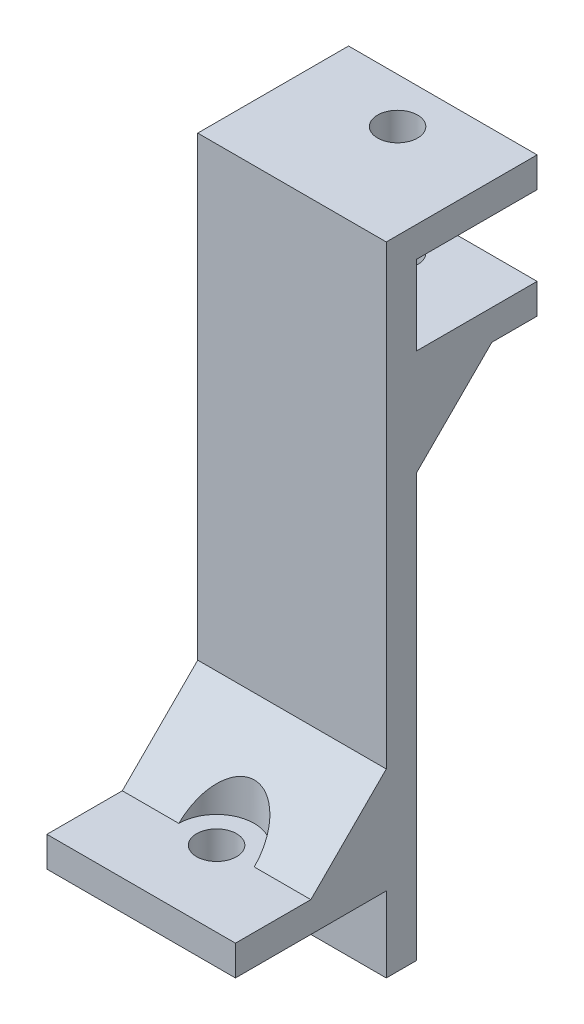
ISO-10303-21;
HEADER;
FILE_DESCRIPTION(('STEP AP214'),'2;1');
FILE_NAME('part.step','',(''),(''),'','','');
FILE_SCHEMA(('AUTOMOTIVE_DESIGN { 1 0 10303 214 1 1 1 1 }'));
ENDSEC;
DATA;
#1=APPLICATION_CONTEXT('core data for automotive mechanical design processes');
#2=APPLICATION_PROTOCOL_DEFINITION('international standard','automotive_design',2000,#1);
#3=PRODUCT_CONTEXT('',#1,'mechanical');
#4=PRODUCT('Part','Part','',(#3));
#5=PRODUCT_RELATED_PRODUCT_CATEGORY('part','',(#4));
#6=PRODUCT_DEFINITION_FORMATION('','',#4);
#7=PRODUCT_DEFINITION_CONTEXT('part definition',#1,'design');
#8=PRODUCT_DEFINITION('design','',#6,#7);
#9=PRODUCT_DEFINITION_SHAPE('','',#8);
#10=(LENGTH_UNIT() NAMED_UNIT(*) SI_UNIT(.MILLI.,.METRE.));
#11=(NAMED_UNIT(*) PLANE_ANGLE_UNIT() SI_UNIT($,.RADIAN.));
#12=(NAMED_UNIT(*) SI_UNIT($,.STERADIAN.) SOLID_ANGLE_UNIT());
#13=UNCERTAINTY_MEASURE_WITH_UNIT(LENGTH_MEASURE(1.E-05),#10,'distance_accuracy_value','');
#14=(GEOMETRIC_REPRESENTATION_CONTEXT(3) GLOBAL_UNCERTAINTY_ASSIGNED_CONTEXT((#13)) GLOBAL_UNIT_ASSIGNED_CONTEXT((#10,
#11,#12)) REPRESENTATION_CONTEXT('',''));
#15=CARTESIAN_POINT('',(0.,0.,0.));
#16=DIRECTION('',(0.,0.,1.));
#17=DIRECTION('',(1.,0.,0.));
#18=AXIS2_PLACEMENT_3D('',#15,#16,#17);
#19=CARTESIAN_POINT('',(12.5,0.,-14.));
#20=DIRECTION('',(0.,1.,0.));
#21=DIRECTION('',(0.,0.,1.));
#22=AXIS2_PLACEMENT_3D('',#19,#20,#21);
#23=CYLINDRICAL_SURFACE('',#22,2.65);
#24=CARTESIAN_POINT('',(12.5,70.,-13.9999999999999));
#25=DIRECTION('',(0.,-1.,0.));
#26=DIRECTION('',(0.,0.,-1.));
#27=AXIS2_PLACEMENT_3D('',#24,#25,#26);
#28=CIRCLE('',#27,2.65);
#29=CARTESIAN_POINT('',(12.5,70.,-16.6499999999999));
#30=VERTEX_POINT('',#29);
#31=EDGE_CURVE('E469',#30,#30,#28,.T.);
#32=ORIENTED_EDGE('',*,*,#31,.F.);
#33=EDGE_LOOP('',(#32));
#34=FACE_BOUND('',#33,.T.);
#35=CARTESIAN_POINT('',(12.5,66.,-13.9999999999999));
#36=DIRECTION('',(0.,1.,0.));
#37=DIRECTION('',(0.,0.,1.));
#38=AXIS2_PLACEMENT_3D('',#35,#36,#37);
#39=CIRCLE('',#38,2.65);
#40=CARTESIAN_POINT('',(12.5,66.,-11.3499999999999));
#41=VERTEX_POINT('',#40);
#42=EDGE_CURVE('E344',#41,#41,#39,.T.);
#43=ORIENTED_EDGE('',*,*,#42,.F.);
#44=EDGE_LOOP('',(#43));
#45=FACE_BOUND('',#44,.T.);
#46=ADVANCED_FACE('F41',(#34,#45),#23,.F.);
#47=CARTESIAN_POINT('',(25.,66.,-14.0000000000002));
#48=DIRECTION('',(0.,-0.707106781186551,-0.707106781186544));
#49=DIRECTION('',(1.,0.,0.));
#50=AXIS2_PLACEMENT_3D('',#47,#48,#49);
#51=PLANE('',#50);
#52=CARTESIAN_POINT('',(12.5,65.9999999999997,-13.9999999999999));
#53=DIRECTION('',(0.,-0.707106781186551,-0.707106781186544));
#54=DIRECTION('',(0.,0.707106781186544,-0.707106781186551));
#55=AXIS2_PLACEMENT_3D('',#52,#53,#54);
#56=ELLIPSE('',#55,7.07106781186543,5.);
#57=CARTESIAN_POINT('',(17.5,66.,-14.0000000000002));
#58=VERTEX_POINT('',#57);
#59=CARTESIAN_POINT('',(7.5,66.,-14.0000000000002));
#60=VERTEX_POINT('',#59);
#61=EDGE_CURVE('E11',#58,#60,#56,.T.);
#62=ORIENTED_EDGE('',*,*,#61,.F.);
#63=DIRECTION('',(-1.,0.,0.));
#64=VECTOR('',#63,1.);
#65=CARTESIAN_POINT('',(0.,66.,-14.0000000000002));
#66=LINE('',#65,#64);
#67=CARTESIAN_POINT('',(25.,66.,-14.0000000000002));
#68=VERTEX_POINT('',#67);
#69=EDGE_CURVE('E179',#68,#58,#66,.T.);
#70=ORIENTED_EDGE('',*,*,#69,.F.);
#71=DIRECTION('',(0.,-0.707106781186544,0.707106781186551));
#72=VECTOR('',#71,1.);
#73=CARTESIAN_POINT('',(25.,26.0000000000002,26.));
#74=LINE('',#73,#72);
#75=CARTESIAN_POINT('',(25.,55.9999999999999,-3.99999999999999));
#76=VERTEX_POINT('',#75);
#77=EDGE_CURVE('E51',#76,#68,#74,.F.);
#78=ORIENTED_EDGE('',*,*,#77,.F.);
#79=DIRECTION('',(1.,0.,0.));
#80=VECTOR('',#79,1.);
#81=CARTESIAN_POINT('',(25.,55.9999999999999,-3.99999999999999));
#82=LINE('',#81,#80);
#83=CARTESIAN_POINT('',(0.,55.9999999999999,-3.99999999999999));
#84=VERTEX_POINT('',#83);
#85=EDGE_CURVE('E58',#84,#76,#82,.T.);
#86=ORIENTED_EDGE('',*,*,#85,.F.);
#87=DIRECTION('',(0.,0.707106781186544,-0.707106781186551));
#88=VECTOR('',#87,1.);
#89=CARTESIAN_POINT('',(0.,66.,-14.0000000000002));
#90=LINE('',#89,#88);
#91=CARTESIAN_POINT('',(0.,66.,-14.0000000000002));
#92=VERTEX_POINT('',#91);
#93=EDGE_CURVE('E66',#92,#84,#90,.F.);
#94=ORIENTED_EDGE('',*,*,#93,.F.);
#95=DIRECTION('',(-1.,0.,0.));
#96=VECTOR('',#95,1.);
#97=CARTESIAN_POINT('',(0.,66.,-14.0000000000002));
#98=LINE('',#97,#96);
#99=EDGE_CURVE('E180',#60,#92,#98,.T.);
#100=ORIENTED_EDGE('',*,*,#99,.F.);
#101=EDGE_LOOP('',(#62,#70,#78,#86,#94,#100));
#102=FACE_BOUND('',#101,.T.);
#103=ADVANCED_FACE('F44',(#102),#51,.T.);
#104=CARTESIAN_POINT('',(12.5,20.,10.));
#105=DIRECTION('',(0.,-1.,0.));
#106=DIRECTION('',(0.,0.,-1.));
#107=AXIS2_PLACEMENT_3D('',#104,#105,#106);
#108=CYLINDRICAL_SURFACE('',#107,2.65);
#109=CARTESIAN_POINT('',(12.5,10.,10.));
#110=DIRECTION('',(0.,1.,0.));
#111=DIRECTION('',(0.,0.,1.));
#112=AXIS2_PLACEMENT_3D('',#109,#110,#111);
#113=CIRCLE('',#112,2.65);
#114=CARTESIAN_POINT('',(12.5,10.,12.65));
#115=VERTEX_POINT('',#114);
#116=EDGE_CURVE('E340',#115,#115,#113,.F.);
#117=ORIENTED_EDGE('',*,*,#116,.T.);
#118=EDGE_LOOP('',(#117));
#119=FACE_BOUND('',#118,.T.);
#120=CARTESIAN_POINT('',(12.5,14.,10.));
#121=DIRECTION('',(0.,-1.,0.));
#122=DIRECTION('',(0.,0.,-1.));
#123=AXIS2_PLACEMENT_3D('',#120,#121,#122);
#124=CIRCLE('',#123,2.65);
#125=CARTESIAN_POINT('',(12.5,14.,7.35));
#126=VERTEX_POINT('',#125);
#127=EDGE_CURVE('E254',#126,#126,#124,.F.);
#128=ORIENTED_EDGE('',*,*,#127,.T.);
#129=EDGE_LOOP('',(#128));
#130=FACE_BOUND('',#129,.T.);
#131=ADVANCED_FACE('F449',(#119,#130),#108,.F.);
#132=CARTESIAN_POINT('',(25.,14.,10.0000000000002));
#133=DIRECTION('',(0.,0.707106781186551,0.707106781186544));
#134=DIRECTION('',(1.,0.,0.));
#135=AXIS2_PLACEMENT_3D('',#132,#133,#134);
#136=PLANE('',#135);
#137=CARTESIAN_POINT('',(12.5,14.0000000000002,10.));
#138=DIRECTION('',(0.,0.707106781186551,0.707106781186544));
#139=DIRECTION('',(0.,-0.707106781186544,0.707106781186551));
#140=AXIS2_PLACEMENT_3D('',#137,#138,#139);
#141=ELLIPSE('',#140,7.07106781186544,5.);
#142=CARTESIAN_POINT('',(17.5,14.,10.0000000000002));
#143=VERTEX_POINT('',#142);
#144=CARTESIAN_POINT('',(7.5,14.,10.0000000000002));
#145=VERTEX_POINT('',#144);
#146=EDGE_CURVE('E191',#143,#145,#141,.T.);
#147=ORIENTED_EDGE('',*,*,#146,.F.);
#148=DIRECTION('',(-1.,0.,0.));
#149=VECTOR('',#148,1.);
#150=CARTESIAN_POINT('',(0.,14.,10.0000000000002));
#151=LINE('',#150,#149);
#152=CARTESIAN_POINT('',(25.,14.,10.0000000000002));
#153=VERTEX_POINT('',#152);
#154=EDGE_CURVE('E347',#153,#143,#151,.T.);
#155=ORIENTED_EDGE('',*,*,#154,.F.);
#156=DIRECTION('',(0.,0.707106781186544,-0.707106781186551));
#157=VECTOR('',#156,1.);
#158=CARTESIAN_POINT('',(25.,12.0000000000002,12.));
#159=LINE('',#158,#157);
#160=CARTESIAN_POINT('',(25.,24.0000000000001,0.));
#161=VERTEX_POINT('',#160);
#162=EDGE_CURVE('E357',#161,#153,#159,.F.);
#163=ORIENTED_EDGE('',*,*,#162,.F.);
#164=DIRECTION('',(1.,0.,0.));
#165=VECTOR('',#164,1.);
#166=CARTESIAN_POINT('',(25.,24.0000000000001,0.));
#167=LINE('',#166,#165);
#168=CARTESIAN_POINT('',(0.,24.0000000000001,0.));
#169=VERTEX_POINT('',#168);
#170=EDGE_CURVE('E351',#169,#161,#167,.T.);
#171=ORIENTED_EDGE('',*,*,#170,.F.);
#172=DIRECTION('',(0.,-0.707106781186544,0.707106781186551));
#173=VECTOR('',#172,1.);
#174=CARTESIAN_POINT('',(0.,14.,10.0000000000002));
#175=LINE('',#174,#173);
#176=CARTESIAN_POINT('',(0.,14.,10.0000000000002));
#177=VERTEX_POINT('',#176);
#178=EDGE_CURVE('E354',#177,#169,#175,.F.);
#179=ORIENTED_EDGE('',*,*,#178,.F.);
#180=DIRECTION('',(-1.,0.,0.));
#181=VECTOR('',#180,1.);
#182=CARTESIAN_POINT('',(0.,14.,10.0000000000002));
#183=LINE('',#182,#181);
#184=EDGE_CURVE('E339',#145,#177,#183,.T.);
#185=ORIENTED_EDGE('',*,*,#184,.F.);
#186=EDGE_LOOP('',(#147,#155,#163,#171,#179,#185));
#187=FACE_BOUND('',#186,.T.);
#188=ADVANCED_FACE('F376',(#187),#136,.T.);
#189=CARTESIAN_POINT('',(25.,0.,-4.));
#190=DIRECTION('',(0.,1.,0.));
#191=DIRECTION('',(0.,0.,1.));
#192=AXIS2_PLACEMENT_3D('',#189,#190,#191);
#193=PLANE('',#192);
#194=DIRECTION('',(0.,0.,-1.));
#195=VECTOR('',#194,1.);
#196=CARTESIAN_POINT('',(0.,0.,-4.));
#197=LINE('',#196,#195);
#198=CARTESIAN_POINT('',(0.,0.,0.));
#199=VERTEX_POINT('',#198);
#200=CARTESIAN_POINT('',(0.,0.,-4.));
#201=VERTEX_POINT('',#200);
#202=EDGE_CURVE('E249',#199,#201,#197,.T.);
#203=ORIENTED_EDGE('',*,*,#202,.T.);
#204=DIRECTION('',(-1.,0.,0.));
#205=VECTOR('',#204,1.);
#206=CARTESIAN_POINT('',(25.,0.,-4.));
#207=LINE('',#206,#205);
#208=CARTESIAN_POINT('',(25.,0.,-4.));
#209=VERTEX_POINT('',#208);
#210=EDGE_CURVE('E336',#209,#201,#207,.T.);
#211=ORIENTED_EDGE('',*,*,#210,.F.);
#212=DIRECTION('',(0.,0.,-1.));
#213=VECTOR('',#212,1.);
#214=CARTESIAN_POINT('',(25.,0.,-4.));
#215=LINE('',#214,#213);
#216=CARTESIAN_POINT('',(25.,0.,0.));
#217=VERTEX_POINT('',#216);
#218=EDGE_CURVE('E202',#217,#209,#215,.T.);
#219=ORIENTED_EDGE('',*,*,#218,.F.);
#220=DIRECTION('',(-1.,0.,0.));
#221=VECTOR('',#220,1.);
#222=CARTESIAN_POINT('',(25.,0.,0.));
#223=LINE('',#222,#221);
#224=EDGE_CURVE('E248',#217,#199,#223,.T.);
#225=ORIENTED_EDGE('',*,*,#224,.T.);
#226=EDGE_LOOP('',(#203,#211,#219,#225));
#227=FACE_BOUND('',#226,.T.);
#228=ADVANCED_FACE('F432',(#227),#193,.F.);
#229=CARTESIAN_POINT('',(25.,66.,-3.99999999999999));
#230=DIRECTION('',(0.,0.,1.));
#231=DIRECTION('',(0.,-1.,0.));
#232=AXIS2_PLACEMENT_3D('',#229,#230,#231);
#233=PLANE('',#232);
#234=DIRECTION('',(0.,1.,0.));
#235=VECTOR('',#234,1.);
#236=CARTESIAN_POINT('',(0.,66.,-3.99999999999999));
#237=LINE('',#236,#235);
#238=EDGE_CURVE('E253',#201,#84,#237,.T.);
#239=ORIENTED_EDGE('',*,*,#238,.T.);
#240=ORIENTED_EDGE('',*,*,#85,.T.);
#241=DIRECTION('',(0.,1.,0.));
#242=VECTOR('',#241,1.);
#243=CARTESIAN_POINT('',(25.,66.,-3.99999999999999));
#244=LINE('',#243,#242);
#245=EDGE_CURVE('E200',#209,#76,#244,.T.);
#246=ORIENTED_EDGE('',*,*,#245,.F.);
#247=ORIENTED_EDGE('',*,*,#210,.T.);
#248=EDGE_LOOP('',(#239,#240,#246,#247));
#249=FACE_BOUND('',#248,.T.);
#250=ADVANCED_FACE('F433',(#249),#233,.F.);
#251=CARTESIAN_POINT('',(25.,66.,-20.));
#252=DIRECTION('',(0.,1.,0.));
#253=DIRECTION('',(0.,0.,1.));
#254=AXIS2_PLACEMENT_3D('',#251,#252,#253);
#255=PLANE('',#254);
#256=ORIENTED_EDGE('',*,*,#69,.T.);
#257=CARTESIAN_POINT('',(12.5,66.,-13.9999999999999));
#258=DIRECTION('',(0.,-1.,0.));
#259=DIRECTION('',(0.,0.,-1.));
#260=AXIS2_PLACEMENT_3D('',#257,#258,#259);
#261=CIRCLE('',#260,5.);
#262=EDGE_CURVE('E167',#58,#60,#261,.T.);
#263=ORIENTED_EDGE('',*,*,#262,.T.);
#264=ORIENTED_EDGE('',*,*,#99,.T.);
#265=DIRECTION('',(0.,0.,-1.));
#266=VECTOR('',#265,1.);
#267=CARTESIAN_POINT('',(0.,66.,-20.));
#268=LINE('',#267,#266);
#269=CARTESIAN_POINT('',(0.,66.,-20.));
#270=VERTEX_POINT('',#269);
#271=EDGE_CURVE('E257',#92,#270,#268,.T.);
#272=ORIENTED_EDGE('',*,*,#271,.T.);
#273=DIRECTION('',(-1.,0.,0.));
#274=VECTOR('',#273,1.);
#275=CARTESIAN_POINT('',(25.,66.,-20.));
#276=LINE('',#275,#274);
#277=CARTESIAN_POINT('',(25.,66.,-20.));
#278=VERTEX_POINT('',#277);
#279=EDGE_CURVE('E332',#278,#270,#276,.T.);
#280=ORIENTED_EDGE('',*,*,#279,.F.);
#281=DIRECTION('',(0.,0.,-1.));
#282=VECTOR('',#281,1.);
#283=CARTESIAN_POINT('',(25.,66.,-20.));
#284=LINE('',#283,#282);
#285=EDGE_CURVE('E185',#68,#278,#284,.T.);
#286=ORIENTED_EDGE('',*,*,#285,.F.);
#287=EDGE_LOOP('',(#256,#263,#264,#272,#280,#286));
#288=FACE_BOUND('',#287,.T.);
#289=ORIENTED_EDGE('',*,*,#42,.T.);
#290=EDGE_LOOP('',(#289));
#291=FACE_BOUND('',#290,.T.);
#292=ADVANCED_FACE('F182',(#288,#291),#255,.F.);
#293=CARTESIAN_POINT('',(25.,70.,-20.));
#294=DIRECTION('',(0.,0.,1.));
#295=DIRECTION('',(1.,0.,0.));
#296=AXIS2_PLACEMENT_3D('',#293,#294,#295);
#297=PLANE('',#296);
#298=DIRECTION('',(0.,1.,0.));
#299=VECTOR('',#298,1.);
#300=CARTESIAN_POINT('',(0.,70.,-20.));
#301=LINE('',#300,#299);
#302=CARTESIAN_POINT('',(0.,70.,-20.));
#303=VERTEX_POINT('',#302);
#304=EDGE_CURVE('E260',#270,#303,#301,.T.);
#305=ORIENTED_EDGE('',*,*,#304,.T.);
#306=DIRECTION('',(-1.,0.,0.));
#307=VECTOR('',#306,1.);
#308=CARTESIAN_POINT('',(25.,70.,-20.));
#309=LINE('',#308,#307);
#310=CARTESIAN_POINT('',(25.,70.,-20.));
#311=VERTEX_POINT('',#310);
#312=EDGE_CURVE('E328',#311,#303,#309,.T.);
#313=ORIENTED_EDGE('',*,*,#312,.F.);
#314=DIRECTION('',(0.,1.,0.));
#315=VECTOR('',#314,1.);
#316=CARTESIAN_POINT('',(25.,70.,-20.));
#317=LINE('',#316,#315);
#318=EDGE_CURVE('E209',#278,#311,#317,.T.);
#319=ORIENTED_EDGE('',*,*,#318,.F.);
#320=ORIENTED_EDGE('',*,*,#279,.T.);
#321=EDGE_LOOP('',(#305,#313,#319,#320));
#322=FACE_BOUND('',#321,.T.);
#323=ADVANCED_FACE('F415',(#322),#297,.F.);
#324=CARTESIAN_POINT('',(25.,70.,-4.));
#325=DIRECTION('',(0.,-1.,0.));
#326=DIRECTION('',(0.,0.,-1.));
#327=AXIS2_PLACEMENT_3D('',#324,#325,#326);
#328=PLANE('',#327);
#329=ORIENTED_EDGE('',*,*,#31,.T.);
#330=EDGE_LOOP('',(#329));
#331=FACE_BOUND('',#330,.T.);
#332=DIRECTION('',(0.,0.,1.));
#333=VECTOR('',#332,1.);
#334=CARTESIAN_POINT('',(0.,70.,-4.));
#335=LINE('',#334,#333);
#336=CARTESIAN_POINT('',(0.,70.,-4.));
#337=VERTEX_POINT('',#336);
#338=EDGE_CURVE('E263',#303,#337,#335,.T.);
#339=ORIENTED_EDGE('',*,*,#338,.T.);
#340=DIRECTION('',(-1.,0.,0.));
#341=VECTOR('',#340,1.);
#342=CARTESIAN_POINT('',(25.,70.,-4.));
#343=LINE('',#342,#341);
#344=CARTESIAN_POINT('',(25.,70.,-4.));
#345=VERTEX_POINT('',#344);
#346=EDGE_CURVE('E324',#345,#337,#343,.T.);
#347=ORIENTED_EDGE('',*,*,#346,.F.);
#348=DIRECTION('',(0.,0.,1.));
#349=VECTOR('',#348,1.);
#350=CARTESIAN_POINT('',(25.,70.,-4.));
#351=LINE('',#350,#349);
#352=EDGE_CURVE('E217',#311,#345,#351,.T.);
#353=ORIENTED_EDGE('',*,*,#352,.F.);
#354=ORIENTED_EDGE('',*,*,#312,.T.);
#355=EDGE_LOOP('',(#339,#347,#353,#354));
#356=FACE_BOUND('',#355,.T.);
#357=ADVANCED_FACE('F410',(#331,#356),#328,.F.);
#358=CARTESIAN_POINT('',(25.,80.525,-4.));
#359=DIRECTION('',(0.,0.,1.));
#360=DIRECTION('',(0.,-1.,0.));
#361=AXIS2_PLACEMENT_3D('',#358,#359,#360);
#362=PLANE('',#361);
#363=DIRECTION('',(0.,1.,0.));
#364=VECTOR('',#363,1.);
#365=CARTESIAN_POINT('',(0.,80.525,-4.));
#366=LINE('',#365,#364);
#367=CARTESIAN_POINT('',(0.,80.525,-4.));
#368=VERTEX_POINT('',#367);
#369=EDGE_CURVE('E266',#337,#368,#366,.T.);
#370=ORIENTED_EDGE('',*,*,#369,.T.);
#371=DIRECTION('',(-1.,0.,0.));
#372=VECTOR('',#371,1.);
#373=CARTESIAN_POINT('',(25.,80.525,-4.));
#374=LINE('',#373,#372);
#375=CARTESIAN_POINT('',(25.,80.525,-4.));
#376=VERTEX_POINT('',#375);
#377=EDGE_CURVE('E320',#376,#368,#374,.T.);
#378=ORIENTED_EDGE('',*,*,#377,.F.);
#379=DIRECTION('',(0.,1.,0.));
#380=VECTOR('',#379,1.);
#381=CARTESIAN_POINT('',(25.,80.525,-4.));
#382=LINE('',#381,#380);
#383=EDGE_CURVE('E220',#345,#376,#382,.T.);
#384=ORIENTED_EDGE('',*,*,#383,.F.);
#385=ORIENTED_EDGE('',*,*,#346,.T.);
#386=EDGE_LOOP('',(#370,#378,#384,#385));
#387=FACE_BOUND('',#386,.T.);
#388=ADVANCED_FACE('F405',(#387),#362,.F.);
#389=CARTESIAN_POINT('',(25.,80.525,-20.));
#390=DIRECTION('',(0.,1.,0.));
#391=DIRECTION('',(0.,0.,1.));
#392=AXIS2_PLACEMENT_3D('',#389,#390,#391);
#393=PLANE('',#392);
#394=CARTESIAN_POINT('',(12.5,80.525,-13.9999999999998));
#395=DIRECTION('',(0.,1.,0.));
#396=DIRECTION('',(0.,0.,1.));
#397=AXIS2_PLACEMENT_3D('',#394,#395,#396);
#398=CIRCLE('',#397,2.65);
#399=CARTESIAN_POINT('',(12.5,80.525,-11.3499999999998));
#400=VERTEX_POINT('',#399);
#401=EDGE_CURVE('E466',#400,#400,#398,.T.);
#402=ORIENTED_EDGE('',*,*,#401,.T.);
#403=EDGE_LOOP('',(#402));
#404=FACE_BOUND('',#403,.T.);
#405=DIRECTION('',(0.,0.,-1.));
#406=VECTOR('',#405,1.);
#407=CARTESIAN_POINT('',(0.,80.525,-20.));
#408=LINE('',#407,#406);
#409=CARTESIAN_POINT('',(0.,80.525,-20.));
#410=VERTEX_POINT('',#409);
#411=EDGE_CURVE('E269',#368,#410,#408,.T.);
#412=ORIENTED_EDGE('',*,*,#411,.T.);
#413=DIRECTION('',(-1.,0.,0.));
#414=VECTOR('',#413,1.);
#415=CARTESIAN_POINT('',(25.,80.525,-20.));
#416=LINE('',#415,#414);
#417=CARTESIAN_POINT('',(25.,80.525,-20.));
#418=VERTEX_POINT('',#417);
#419=EDGE_CURVE('E316',#418,#410,#416,.T.);
#420=ORIENTED_EDGE('',*,*,#419,.F.);
#421=DIRECTION('',(0.,0.,-1.));
#422=VECTOR('',#421,1.);
#423=CARTESIAN_POINT('',(25.,80.525,-20.));
#424=LINE('',#423,#422);
#425=EDGE_CURVE('E223',#376,#418,#424,.T.);
#426=ORIENTED_EDGE('',*,*,#425,.F.);
#427=ORIENTED_EDGE('',*,*,#377,.T.);
#428=EDGE_LOOP('',(#412,#420,#426,#427));
#429=FACE_BOUND('',#428,.T.);
#430=ADVANCED_FACE('F401',(#404,#429),#393,.F.);
#431=CARTESIAN_POINT('',(25.,84.525,-20.));
#432=DIRECTION('',(0.,0.,1.));
#433=DIRECTION('',(1.,0.,0.));
#434=AXIS2_PLACEMENT_3D('',#431,#432,#433);
#435=PLANE('',#434);
#436=DIRECTION('',(0.,1.,0.));
#437=VECTOR('',#436,1.);
#438=CARTESIAN_POINT('',(0.,84.525,-20.));
#439=LINE('',#438,#437);
#440=CARTESIAN_POINT('',(0.,84.525,-20.));
#441=VERTEX_POINT('',#440);
#442=EDGE_CURVE('E272',#410,#441,#439,.T.);
#443=ORIENTED_EDGE('',*,*,#442,.T.);
#444=DIRECTION('',(-1.,0.,0.));
#445=VECTOR('',#444,1.);
#446=CARTESIAN_POINT('',(25.,84.525,-20.));
#447=LINE('',#446,#445);
#448=CARTESIAN_POINT('',(25.,84.525,-20.));
#449=VERTEX_POINT('',#448);
#450=EDGE_CURVE('E312',#449,#441,#447,.T.);
#451=ORIENTED_EDGE('',*,*,#450,.F.);
#452=DIRECTION('',(0.,1.,0.));
#453=VECTOR('',#452,1.);
#454=CARTESIAN_POINT('',(25.,84.525,-20.));
#455=LINE('',#454,#453);
#456=EDGE_CURVE('E226',#418,#449,#455,.T.);
#457=ORIENTED_EDGE('',*,*,#456,.F.);
#458=ORIENTED_EDGE('',*,*,#419,.T.);
#459=EDGE_LOOP('',(#443,#451,#457,#458));
#460=FACE_BOUND('',#459,.T.);
#461=ADVANCED_FACE('F396',(#460),#435,.F.);
#462=CARTESIAN_POINT('',(25.,84.525,0.));
#463=DIRECTION('',(0.,-1.,0.));
#464=DIRECTION('',(0.,0.,-1.));
#465=AXIS2_PLACEMENT_3D('',#462,#463,#464);
#466=PLANE('',#465);
#467=CARTESIAN_POINT('',(12.5,84.525,-13.9999999999998));
#468=DIRECTION('',(0.,1.,0.));
#469=DIRECTION('',(0.,0.,1.));
#470=AXIS2_PLACEMENT_3D('',#467,#468,#469);
#471=CIRCLE('',#470,2.65);
#472=CARTESIAN_POINT('',(12.5,84.525,-11.3499999999998));
#473=VERTEX_POINT('',#472);
#474=EDGE_CURVE('E373',#473,#473,#471,.T.);
#475=ORIENTED_EDGE('',*,*,#474,.F.);
#476=EDGE_LOOP('',(#475));
#477=FACE_BOUND('',#476,.T.);
#478=DIRECTION('',(0.,0.,1.));
#479=VECTOR('',#478,1.);
#480=CARTESIAN_POINT('',(0.,84.525,0.));
#481=LINE('',#480,#479);
#482=CARTESIAN_POINT('',(0.,84.525,0.));
#483=VERTEX_POINT('',#482);
#484=EDGE_CURVE('E275',#441,#483,#481,.T.);
#485=ORIENTED_EDGE('',*,*,#484,.T.);
#486=DIRECTION('',(-1.,0.,0.));
#487=VECTOR('',#486,1.);
#488=CARTESIAN_POINT('',(25.,84.525,0.));
#489=LINE('',#488,#487);
#490=CARTESIAN_POINT('',(25.,84.525,0.));
#491=VERTEX_POINT('',#490);
#492=EDGE_CURVE('E308',#491,#483,#489,.T.);
#493=ORIENTED_EDGE('',*,*,#492,.F.);
#494=DIRECTION('',(0.,0.,1.));
#495=VECTOR('',#494,1.);
#496=CARTESIAN_POINT('',(25.,84.525,0.));
#497=LINE('',#496,#495);
#498=EDGE_CURVE('E229',#449,#491,#497,.T.);
#499=ORIENTED_EDGE('',*,*,#498,.F.);
#500=ORIENTED_EDGE('',*,*,#450,.T.);
#501=EDGE_LOOP('',(#485,#493,#499,#500));
#502=FACE_BOUND('',#501,.T.);
#503=ADVANCED_FACE('F390',(#477,#502),#466,.F.);
#504=CARTESIAN_POINT('',(25.,14.,0.));
#505=DIRECTION('',(0.,0.,-1.));
#506=DIRECTION('',(-1.,0.,0.));
#507=AXIS2_PLACEMENT_3D('',#504,#505,#506);
#508=PLANE('',#507);
#509=DIRECTION('',(0.,-1.,0.));
#510=VECTOR('',#509,1.);
#511=CARTESIAN_POINT('',(0.,14.,0.));
#512=LINE('',#511,#510);
#513=EDGE_CURVE('E278',#483,#169,#512,.T.);
#514=ORIENTED_EDGE('',*,*,#513,.T.);
#515=ORIENTED_EDGE('',*,*,#170,.T.);
#516=DIRECTION('',(0.,-1.,0.));
#517=VECTOR('',#516,1.);
#518=CARTESIAN_POINT('',(25.,14.,0.));
#519=LINE('',#518,#517);
#520=EDGE_CURVE('E232',#491,#161,#519,.T.);
#521=ORIENTED_EDGE('',*,*,#520,.F.);
#522=ORIENTED_EDGE('',*,*,#492,.T.);
#523=EDGE_LOOP('',(#514,#515,#521,#522));
#524=FACE_BOUND('',#523,.T.);
#525=ADVANCED_FACE('F385',(#524),#508,.F.);
#526=CARTESIAN_POINT('',(25.,14.,0.));
#527=DIRECTION('',(0.,-1.,0.));
#528=DIRECTION('',(0.,0.,-1.));
#529=AXIS2_PLACEMENT_3D('',#526,#527,#528);
#530=PLANE('',#529);
#531=ORIENTED_EDGE('',*,*,#154,.T.);
#532=CARTESIAN_POINT('',(12.5,14.,10.));
#533=DIRECTION('',(0.,1.,0.));
#534=DIRECTION('',(0.,0.,1.));
#535=AXIS2_PLACEMENT_3D('',#532,#533,#534);
#536=CIRCLE('',#535,5.);
#537=EDGE_CURVE('E174',#143,#145,#536,.T.);
#538=ORIENTED_EDGE('',*,*,#537,.T.);
#539=ORIENTED_EDGE('',*,*,#184,.T.);
#540=DIRECTION('',(0.,0.,1.));
#541=VECTOR('',#540,1.);
#542=CARTESIAN_POINT('',(0.,14.,0.));
#543=LINE('',#542,#541);
#544=CARTESIAN_POINT('',(0.,14.,20.));
#545=VERTEX_POINT('',#544);
#546=EDGE_CURVE('E282',#177,#545,#543,.T.);
#547=ORIENTED_EDGE('',*,*,#546,.T.);
#548=DIRECTION('',(-1.,0.,0.));
#549=VECTOR('',#548,1.);
#550=CARTESIAN_POINT('',(25.,14.,20.));
#551=LINE('',#550,#549);
#552=CARTESIAN_POINT('',(25.,14.,20.));
#553=VERTEX_POINT('',#552);
#554=EDGE_CURVE('E304',#553,#545,#551,.T.);
#555=ORIENTED_EDGE('',*,*,#554,.F.);
#556=DIRECTION('',(0.,0.,1.));
#557=VECTOR('',#556,1.);
#558=CARTESIAN_POINT('',(25.,14.,0.));
#559=LINE('',#558,#557);
#560=EDGE_CURVE('E236',#153,#553,#559,.T.);
#561=ORIENTED_EDGE('',*,*,#560,.F.);
#562=EDGE_LOOP('',(#531,#538,#539,#547,#555,#561));
#563=FACE_BOUND('',#562,.T.);
#564=ORIENTED_EDGE('',*,*,#127,.F.);
#565=EDGE_LOOP('',(#564));
#566=FACE_BOUND('',#565,.T.);
#567=ADVANCED_FACE('F368',(#563,#566),#530,.F.);
#568=CARTESIAN_POINT('',(25.,14.,20.));
#569=DIRECTION('',(0.,0.,-1.));
#570=DIRECTION('',(-1.,0.,0.));
#571=AXIS2_PLACEMENT_3D('',#568,#569,#570);
#572=PLANE('',#571);
#573=DIRECTION('',(0.,-1.,0.));
#574=VECTOR('',#573,1.);
#575=CARTESIAN_POINT('',(0.,14.,20.));
#576=LINE('',#575,#574);
#577=CARTESIAN_POINT('',(0.,10.,20.));
#578=VERTEX_POINT('',#577);
#579=EDGE_CURVE('E285',#545,#578,#576,.T.);
#580=ORIENTED_EDGE('',*,*,#579,.T.);
#581=DIRECTION('',(-1.,0.,0.));
#582=VECTOR('',#581,1.);
#583=CARTESIAN_POINT('',(25.,10.,20.));
#584=LINE('',#583,#582);
#585=CARTESIAN_POINT('',(25.,10.,20.));
#586=VERTEX_POINT('',#585);
#587=EDGE_CURVE('E300',#586,#578,#584,.T.);
#588=ORIENTED_EDGE('',*,*,#587,.F.);
#589=DIRECTION('',(0.,-1.,0.));
#590=VECTOR('',#589,1.);
#591=CARTESIAN_POINT('',(25.,14.,20.));
#592=LINE('',#591,#590);
#593=EDGE_CURVE('E239',#553,#586,#592,.T.);
#594=ORIENTED_EDGE('',*,*,#593,.F.);
#595=ORIENTED_EDGE('',*,*,#554,.T.);
#596=EDGE_LOOP('',(#580,#588,#594,#595));
#597=FACE_BOUND('',#596,.T.);
#598=ADVANCED_FACE('F420',(#597),#572,.F.);
#599=CARTESIAN_POINT('',(25.,10.,20.));
#600=DIRECTION('',(0.,1.,0.));
#601=DIRECTION('',(0.,0.,1.));
#602=AXIS2_PLACEMENT_3D('',#599,#600,#601);
#603=PLANE('',#602);
#604=ORIENTED_EDGE('',*,*,#116,.F.);
#605=EDGE_LOOP('',(#604));
#606=FACE_BOUND('',#605,.T.);
#607=DIRECTION('',(0.,0.,-1.));
#608=VECTOR('',#607,1.);
#609=CARTESIAN_POINT('',(0.,10.,20.));
#610=LINE('',#609,#608);
#611=CARTESIAN_POINT('',(0.,10.,0.));
#612=VERTEX_POINT('',#611);
#613=EDGE_CURVE('E288',#578,#612,#610,.T.);
#614=ORIENTED_EDGE('',*,*,#613,.T.);
#615=DIRECTION('',(-1.,0.,0.));
#616=VECTOR('',#615,1.);
#617=CARTESIAN_POINT('',(25.,10.,0.));
#618=LINE('',#617,#616);
#619=CARTESIAN_POINT('',(25.,10.,0.));
#620=VERTEX_POINT('',#619);
#621=EDGE_CURVE('E296',#620,#612,#618,.T.);
#622=ORIENTED_EDGE('',*,*,#621,.F.);
#623=DIRECTION('',(0.,0.,-1.));
#624=VECTOR('',#623,1.);
#625=CARTESIAN_POINT('',(25.,10.,20.));
#626=LINE('',#625,#624);
#627=EDGE_CURVE('E242',#586,#620,#626,.T.);
#628=ORIENTED_EDGE('',*,*,#627,.F.);
#629=ORIENTED_EDGE('',*,*,#587,.T.);
#630=EDGE_LOOP('',(#614,#622,#628,#629));
#631=FACE_BOUND('',#630,.T.);
#632=ADVANCED_FACE('F426',(#606,#631),#603,.F.);
#633=CARTESIAN_POINT('',(25.,0.,0.));
#634=DIRECTION('',(0.,0.,-1.));
#635=DIRECTION('',(-1.,0.,0.));
#636=AXIS2_PLACEMENT_3D('',#633,#634,#635);
#637=PLANE('',#636);
#638=DIRECTION('',(0.,-1.,0.));
#639=VECTOR('',#638,1.);
#640=CARTESIAN_POINT('',(0.,0.,0.));
#641=LINE('',#640,#639);
#642=EDGE_CURVE('E211',#612,#199,#641,.T.);
#643=ORIENTED_EDGE('',*,*,#642,.T.);
#644=ORIENTED_EDGE('',*,*,#224,.F.);
#645=DIRECTION('',(0.,-1.,0.));
#646=VECTOR('',#645,1.);
#647=CARTESIAN_POINT('',(25.,0.,0.));
#648=LINE('',#647,#646);
#649=EDGE_CURVE('E245',#620,#217,#648,.T.);
#650=ORIENTED_EDGE('',*,*,#649,.F.);
#651=ORIENTED_EDGE('',*,*,#621,.T.);
#652=EDGE_LOOP('',(#643,#644,#650,#651));
#653=FACE_BOUND('',#652,.T.);
#654=ADVANCED_FACE('F430',(#653),#637,.F.);
#655=CARTESIAN_POINT('',(25.,0.,0.));
#656=DIRECTION('',(-1.,0.,0.));
#657=DIRECTION('',(0.,0.,1.));
#658=AXIS2_PLACEMENT_3D('',#655,#656,#657);
#659=PLANE('',#658);
#660=ORIENTED_EDGE('',*,*,#218,.T.);
#661=ORIENTED_EDGE('',*,*,#245,.T.);
#662=ORIENTED_EDGE('',*,*,#77,.T.);
#663=ORIENTED_EDGE('',*,*,#285,.T.);
#664=ORIENTED_EDGE('',*,*,#318,.T.);
#665=ORIENTED_EDGE('',*,*,#352,.T.);
#666=ORIENTED_EDGE('',*,*,#383,.T.);
#667=ORIENTED_EDGE('',*,*,#425,.T.);
#668=ORIENTED_EDGE('',*,*,#456,.T.);
#669=ORIENTED_EDGE('',*,*,#498,.T.);
#670=ORIENTED_EDGE('',*,*,#520,.T.);
#671=ORIENTED_EDGE('',*,*,#162,.T.);
#672=ORIENTED_EDGE('',*,*,#560,.T.);
#673=ORIENTED_EDGE('',*,*,#593,.T.);
#674=ORIENTED_EDGE('',*,*,#627,.T.);
#675=ORIENTED_EDGE('',*,*,#649,.T.);
#676=EDGE_LOOP('',(#660,#661,#662,#663,#664,#665,#666,#667,#668,#669,#670,#671,#672,#673,#674,#675));
#677=FACE_BOUND('',#676,.T.);
#678=ADVANCED_FACE('F199',(#677),#659,.F.);
#679=CARTESIAN_POINT('',(0.,0.,0.));
#680=DIRECTION('',(-1.,0.,0.));
#681=DIRECTION('',(0.,0.,1.));
#682=AXIS2_PLACEMENT_3D('',#679,#680,#681);
#683=PLANE('',#682);
#684=ORIENTED_EDGE('',*,*,#202,.F.);
#685=ORIENTED_EDGE('',*,*,#642,.F.);
#686=ORIENTED_EDGE('',*,*,#613,.F.);
#687=ORIENTED_EDGE('',*,*,#579,.F.);
#688=ORIENTED_EDGE('',*,*,#546,.F.);
#689=ORIENTED_EDGE('',*,*,#178,.T.);
#690=ORIENTED_EDGE('',*,*,#513,.F.);
#691=ORIENTED_EDGE('',*,*,#484,.F.);
#692=ORIENTED_EDGE('',*,*,#442,.F.);
#693=ORIENTED_EDGE('',*,*,#411,.F.);
#694=ORIENTED_EDGE('',*,*,#369,.F.);
#695=ORIENTED_EDGE('',*,*,#338,.F.);
#696=ORIENTED_EDGE('',*,*,#304,.F.);
#697=ORIENTED_EDGE('',*,*,#271,.F.);
#698=ORIENTED_EDGE('',*,*,#93,.T.);
#699=ORIENTED_EDGE('',*,*,#238,.F.);
#700=EDGE_LOOP('',(#684,#685,#686,#687,#688,#689,#690,#691,#692,#693,#694,#695,#696,#697,#698,#699));
#701=FACE_BOUND('',#700,.T.);
#702=ADVANCED_FACE('F381',(#701),#683,.T.);
#703=ORIENTED_EDGE('',*,*,#474,.T.);
#704=EDGE_LOOP('',(#703));
#705=FACE_BOUND('',#704,.T.);
#706=ORIENTED_EDGE('',*,*,#401,.F.);
#707=EDGE_LOOP('',(#706));
#708=FACE_BOUND('',#707,.T.);
#709=ADVANCED_FACE('F445',(#705,#708),#23,.F.);
#710=CARTESIAN_POINT('',(12.5,20.,10.));
#711=DIRECTION('',(0.,-1.,0.));
#712=DIRECTION('',(0.,0.,-1.));
#713=AXIS2_PLACEMENT_3D('',#710,#711,#712);
#714=CYLINDRICAL_SURFACE('',#713,5.);
#715=ORIENTED_EDGE('',*,*,#146,.T.);
#716=ORIENTED_EDGE('',*,*,#537,.F.);
#717=EDGE_LOOP('',(#715,#716));
#718=FACE_BOUND('',#717,.T.);
#719=ADVANCED_FACE('F363',(#718),#714,.F.);
#720=CARTESIAN_POINT('',(12.5,60.,-13.9999999999999));
#721=DIRECTION('',(0.,1.,0.));
#722=DIRECTION('',(0.,0.,1.));
#723=AXIS2_PLACEMENT_3D('',#720,#721,#722);
#724=CYLINDRICAL_SURFACE('',#723,5.);
#725=ORIENTED_EDGE('',*,*,#61,.T.);
#726=ORIENTED_EDGE('',*,*,#262,.F.);
#727=EDGE_LOOP('',(#725,#726));
#728=FACE_BOUND('',#727,.T.);
#729=ADVANCED_FACE('F169',(#728),#724,.F.);
#730=CLOSED_SHELL('',(#46,#103,#131,#188,#228,#250,#292,#323,#357,#388,#430,#461,#503,#525,#567,
#598,#632,#654,#678,#702,#709,#719,#729));
#731=MANIFOLD_SOLID_BREP('B2',#730);
#732=ADVANCED_BREP_SHAPE_REPRESENTATION('',(#18,#731),#14);
#733=SHAPE_DEFINITION_REPRESENTATION(#9,#732);
ENDSEC;
END-ISO-10303-21;
